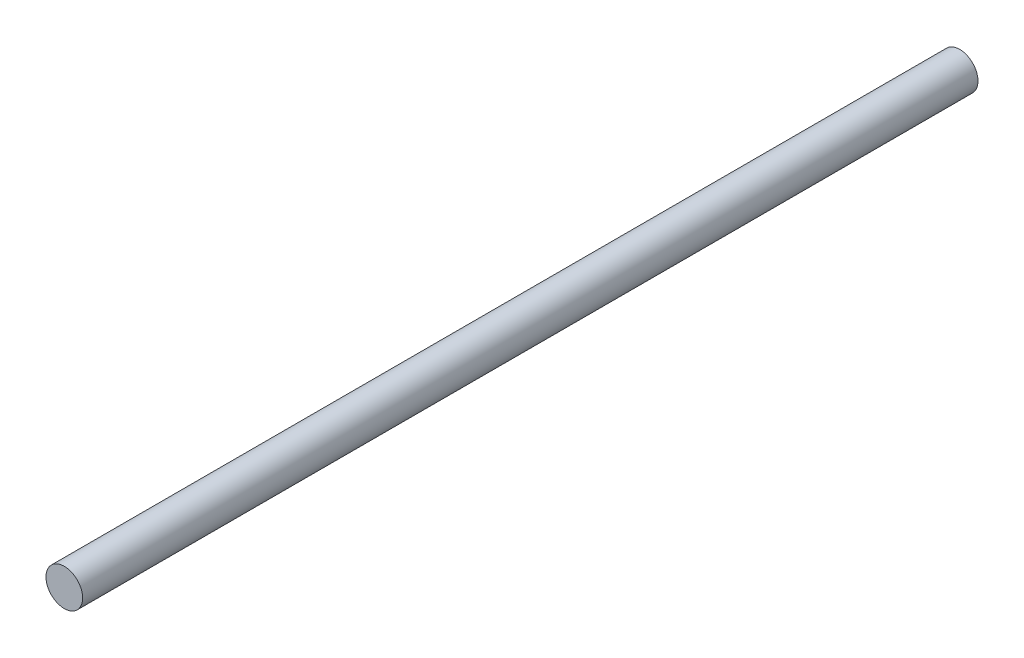
ISO-10303-21;
HEADER;
FILE_DESCRIPTION(('STEP AP214'),'2;1');
FILE_NAME('part.step','',(''),(''),'','','');
FILE_SCHEMA(('AUTOMOTIVE_DESIGN { 1 0 10303 214 1 1 1 1 }'));
ENDSEC;
DATA;
#1=APPLICATION_CONTEXT('core data for automotive mechanical design processes');
#2=APPLICATION_PROTOCOL_DEFINITION('international standard','automotive_design',2000,#1);
#3=PRODUCT_CONTEXT('',#1,'mechanical');
#4=PRODUCT('Part','Part','',(#3));
#5=PRODUCT_RELATED_PRODUCT_CATEGORY('part','',(#4));
#6=PRODUCT_DEFINITION_FORMATION('','',#4);
#7=PRODUCT_DEFINITION_CONTEXT('part definition',#1,'design');
#8=PRODUCT_DEFINITION('design','',#6,#7);
#9=PRODUCT_DEFINITION_SHAPE('','',#8);
#10=(LENGTH_UNIT() NAMED_UNIT(*) SI_UNIT(.MILLI.,.METRE.));
#11=(NAMED_UNIT(*) PLANE_ANGLE_UNIT() SI_UNIT($,.RADIAN.));
#12=(NAMED_UNIT(*) SI_UNIT($,.STERADIAN.) SOLID_ANGLE_UNIT());
#13=UNCERTAINTY_MEASURE_WITH_UNIT(LENGTH_MEASURE(1.E-05),#10,'distance_accuracy_value','');
#14=(GEOMETRIC_REPRESENTATION_CONTEXT(3) GLOBAL_UNCERTAINTY_ASSIGNED_CONTEXT((#13)) GLOBAL_UNIT_ASSIGNED_CONTEXT((#10,
#11,#12)) REPRESENTATION_CONTEXT('',''));
#15=CARTESIAN_POINT('',(0.,0.,0.));
#16=DIRECTION('',(0.,0.,1.));
#17=DIRECTION('',(1.,0.,0.));
#18=AXIS2_PLACEMENT_3D('',#15,#16,#17);
#19=CARTESIAN_POINT('',(0.,0.,105.));
#20=DIRECTION('',(0.,0.,-1.));
#21=DIRECTION('',(-1.,0.,0.));
#22=AXIS2_PLACEMENT_3D('',#19,#20,#21);
#23=CYLINDRICAL_SURFACE('',#22,2.15);
#24=CARTESIAN_POINT('',(0.,0.,105.));
#25=DIRECTION('',(0.,0.,1.));
#26=DIRECTION('',(1.,0.,0.));
#27=AXIS2_PLACEMENT_3D('',#24,#25,#26);
#28=CIRCLE('',#27,2.15);
#29=CARTESIAN_POINT('',(2.15,0.,105.));
#30=VERTEX_POINT('',#29);
#31=EDGE_CURVE('E10',#30,#30,#28,.T.);
#32=ORIENTED_EDGE('',*,*,#31,.F.);
#33=EDGE_LOOP('',(#32));
#34=FACE_BOUND('',#33,.T.);
#35=CARTESIAN_POINT('',(0.,0.,0.));
#36=DIRECTION('',(0.,0.,1.));
#37=DIRECTION('',(1.,0.,0.));
#38=AXIS2_PLACEMENT_3D('',#35,#36,#37);
#39=CIRCLE('',#38,2.15);
#40=CARTESIAN_POINT('',(2.15,0.,0.));
#41=VERTEX_POINT('',#40);
#42=EDGE_CURVE('E34',#41,#41,#39,.T.);
#43=ORIENTED_EDGE('',*,*,#42,.T.);
#44=EDGE_LOOP('',(#43));
#45=FACE_BOUND('',#44,.T.);
#46=ADVANCED_FACE('F31',(#34,#45),#23,.T.);
#47=CARTESIAN_POINT('',(0.,0.,105.));
#48=DIRECTION('',(0.,0.,1.));
#49=DIRECTION('',(1.,0.,0.));
#50=AXIS2_PLACEMENT_3D('',#47,#48,#49);
#51=PLANE('',#50);
#52=ORIENTED_EDGE('',*,*,#31,.T.);
#53=EDGE_LOOP('',(#52));
#54=FACE_BOUND('',#53,.T.);
#55=ADVANCED_FACE('F46',(#54),#51,.T.);
#56=CARTESIAN_POINT('',(0.,0.,0.));
#57=DIRECTION('',(0.,0.,1.));
#58=DIRECTION('',(1.,0.,0.));
#59=AXIS2_PLACEMENT_3D('',#56,#57,#58);
#60=PLANE('',#59);
#61=ORIENTED_EDGE('',*,*,#42,.F.);
#62=EDGE_LOOP('',(#61));
#63=FACE_BOUND('',#62,.T.);
#64=ADVANCED_FACE('F44',(#63),#60,.F.);
#65=CLOSED_SHELL('',(#46,#55,#64));
#66=MANIFOLD_SOLID_BREP('B2',#65);
#67=ADVANCED_BREP_SHAPE_REPRESENTATION('',(#18,#66),#14);
#68=SHAPE_DEFINITION_REPRESENTATION(#9,#67);
ENDSEC;
END-ISO-10303-21;
